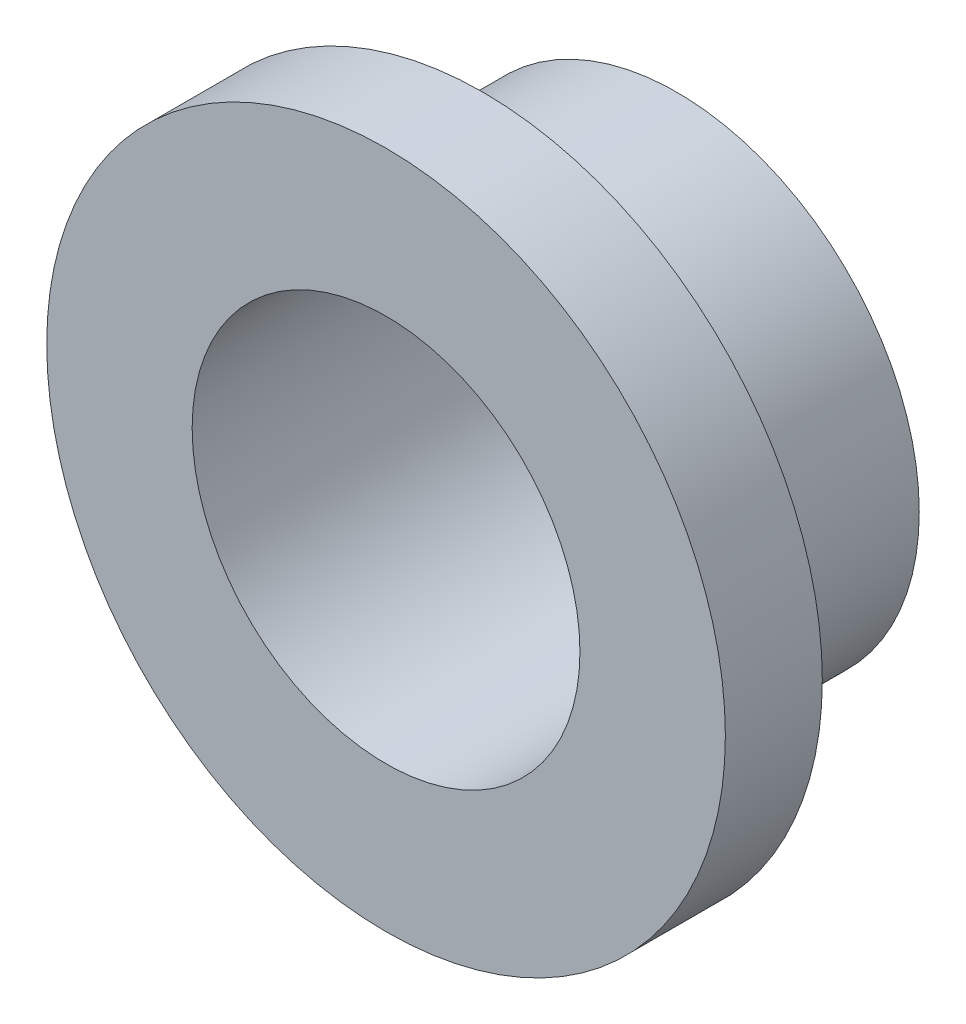
ISO-10303-21;
HEADER;
FILE_DESCRIPTION(('STEP AP214'),'2;1');
FILE_NAME('part.step','',(''),(''),'','','');
FILE_SCHEMA(('AUTOMOTIVE_DESIGN { 1 0 10303 214 1 1 1 1 }'));
ENDSEC;
DATA;
#1=APPLICATION_CONTEXT('core data for automotive mechanical design processes');
#2=APPLICATION_PROTOCOL_DEFINITION('international standard','automotive_design',2000,#1);
#3=PRODUCT_CONTEXT('',#1,'mechanical');
#4=PRODUCT('Part','Part','',(#3));
#5=PRODUCT_RELATED_PRODUCT_CATEGORY('part','',(#4));
#6=PRODUCT_DEFINITION_FORMATION('','',#4);
#7=PRODUCT_DEFINITION_CONTEXT('part definition',#1,'design');
#8=PRODUCT_DEFINITION('design','',#6,#7);
#9=PRODUCT_DEFINITION_SHAPE('','',#8);
#10=(LENGTH_UNIT() NAMED_UNIT(*) SI_UNIT(.MILLI.,.METRE.));
#11=(NAMED_UNIT(*) PLANE_ANGLE_UNIT() SI_UNIT($,.RADIAN.));
#12=(NAMED_UNIT(*) SI_UNIT($,.STERADIAN.) SOLID_ANGLE_UNIT());
#13=UNCERTAINTY_MEASURE_WITH_UNIT(LENGTH_MEASURE(1.E-05),#10,'distance_accuracy_value','');
#14=(GEOMETRIC_REPRESENTATION_CONTEXT(3) GLOBAL_UNCERTAINTY_ASSIGNED_CONTEXT((#13)) GLOBAL_UNIT_ASSIGNED_CONTEXT((#10,
#11,#12)) REPRESENTATION_CONTEXT('',''));
#15=CARTESIAN_POINT('',(0.,0.,0.));
#16=DIRECTION('',(0.,0.,1.));
#17=DIRECTION('',(1.,0.,0.));
#18=AXIS2_PLACEMENT_3D('',#15,#16,#17);
#19=CARTESIAN_POINT('',(0.,0.,9.525));
#20=DIRECTION('',(0.,0.,-1.));
#21=DIRECTION('',(-1.,0.,0.));
#22=AXIS2_PLACEMENT_3D('',#19,#20,#21);
#23=CYLINDRICAL_SURFACE('',#22,7.9375);
#24=CARTESIAN_POINT('',(0.,0.,0.));
#25=DIRECTION('',(0.,0.,1.));
#26=DIRECTION('',(1.,0.,0.));
#27=AXIS2_PLACEMENT_3D('',#24,#25,#26);
#28=CIRCLE('',#27,7.9375);
#29=CARTESIAN_POINT('',(-7.9375,0.,0.));
#30=VERTEX_POINT('',#29);
#31=EDGE_CURVE('E33',#30,#30,#28,.T.);
#32=CARTESIAN_POINT('',(0.,0.,6.35));
#33=DIRECTION('',(0.,0.,1.));
#34=DIRECTION('',(1.,0.,0.));
#35=AXIS2_PLACEMENT_3D('',#32,#33,#34);
#36=CIRCLE('',#35,7.9375);
#37=CARTESIAN_POINT('',(-7.9375,0.,6.35));
#38=VERTEX_POINT('',#37);
#39=EDGE_CURVE('E10',#38,#38,#36,.T.);
#40=CARTESIAN_POINT('',(-7.9375,0.,0.));
#41=CARTESIAN_POINT('',(-7.9375,0.,0.0661458333333336));
#42=CARTESIAN_POINT('',(-7.9375,0.,0.132291666666667));
#43=CARTESIAN_POINT('',(-7.9375,0.,0.264583333333334));
#44=CARTESIAN_POINT('',(-7.9375,0.,0.330729166666667));
#45=CARTESIAN_POINT('',(-7.9375,0.,0.463020833333333));
#46=CARTESIAN_POINT('',(-7.9375,0.,0.529166666666667));
#47=CARTESIAN_POINT('',(-7.9375,0.,0.661458333333333));
#48=CARTESIAN_POINT('',(-7.9375,0.,0.727604166666666));
#49=CARTESIAN_POINT('',(-7.9375,0.,0.859895833333333));
#50=CARTESIAN_POINT('',(-7.9375,0.,0.926041666666666));
#51=CARTESIAN_POINT('',(-7.9375,0.,1.05833333333333));
#52=CARTESIAN_POINT('',(-7.9375,0.,1.12447916666667));
#53=CARTESIAN_POINT('',(-7.9375,0.,1.25677083333333));
#54=CARTESIAN_POINT('',(-7.9375,0.,1.32291666666667));
#55=CARTESIAN_POINT('',(-7.9375,0.,1.45520833333333));
#56=CARTESIAN_POINT('',(-7.9375,0.,1.52135416666667));
#57=CARTESIAN_POINT('',(-7.9375,0.,1.65364583333333));
#58=CARTESIAN_POINT('',(-7.9375,0.,1.71979166666667));
#59=CARTESIAN_POINT('',(-7.9375,0.,1.85208333333333));
#60=CARTESIAN_POINT('',(-7.9375,0.,1.91822916666667));
#61=CARTESIAN_POINT('',(-7.9375,0.,2.05052083333333));
#62=CARTESIAN_POINT('',(-7.9375,0.,2.11666666666667));
#63=CARTESIAN_POINT('',(-7.9375,0.,2.24895833333333));
#64=CARTESIAN_POINT('',(-7.9375,0.,2.31510416666667));
#65=CARTESIAN_POINT('',(-7.9375,0.,2.44739583333333));
#66=CARTESIAN_POINT('',(-7.9375,0.,2.51354166666667));
#67=CARTESIAN_POINT('',(-7.9375,0.,2.64583333333333));
#68=CARTESIAN_POINT('',(-7.9375,0.,2.71197916666667));
#69=CARTESIAN_POINT('',(-7.9375,0.,2.84427083333333));
#70=CARTESIAN_POINT('',(-7.9375,0.,2.91041666666667));
#71=CARTESIAN_POINT('',(-7.9375,0.,3.04270833333333));
#72=CARTESIAN_POINT('',(-7.9375,0.,3.10885416666667));
#73=CARTESIAN_POINT('',(-7.9375,0.,3.24114583333333));
#74=CARTESIAN_POINT('',(-7.9375,0.,3.30729166666667));
#75=CARTESIAN_POINT('',(-7.9375,0.,3.43958333333333));
#76=CARTESIAN_POINT('',(-7.9375,0.,3.50572916666667));
#77=CARTESIAN_POINT('',(-7.9375,0.,3.63802083333333));
#78=CARTESIAN_POINT('',(-7.9375,0.,3.70416666666667));
#79=CARTESIAN_POINT('',(-7.9375,0.,3.83645833333333));
#80=CARTESIAN_POINT('',(-7.9375,0.,3.90260416666667));
#81=CARTESIAN_POINT('',(-7.9375,0.,4.03489583333333));
#82=CARTESIAN_POINT('',(-7.9375,0.,4.10104166666667));
#83=CARTESIAN_POINT('',(-7.9375,0.,4.23333333333333));
#84=CARTESIAN_POINT('',(-7.9375,0.,4.29947916666667));
#85=CARTESIAN_POINT('',(-7.9375,0.,4.43177083333333));
#86=CARTESIAN_POINT('',(-7.9375,0.,4.49791666666667));
#87=CARTESIAN_POINT('',(-7.9375,0.,4.63020833333333));
#88=CARTESIAN_POINT('',(-7.9375,0.,4.69635416666667));
#89=CARTESIAN_POINT('',(-7.9375,0.,4.82864583333333));
#90=CARTESIAN_POINT('',(-7.9375,0.,4.89479166666667));
#91=CARTESIAN_POINT('',(-7.9375,0.,5.02708333333333));
#92=CARTESIAN_POINT('',(-7.9375,0.,5.09322916666667));
#93=CARTESIAN_POINT('',(-7.9375,0.,5.22552083333333));
#94=CARTESIAN_POINT('',(-7.9375,0.,5.29166666666667));
#95=CARTESIAN_POINT('',(-7.9375,0.,5.42395833333333));
#96=CARTESIAN_POINT('',(-7.9375,0.,5.49010416666667));
#97=CARTESIAN_POINT('',(-7.9375,0.,5.62239583333333));
#98=CARTESIAN_POINT('',(-7.9375,0.,5.68854166666667));
#99=CARTESIAN_POINT('',(-7.9375,0.,5.82083333333333));
#100=CARTESIAN_POINT('',(-7.9375,0.,5.88697916666667));
#101=CARTESIAN_POINT('',(-7.9375,0.,6.01927083333333));
#102=CARTESIAN_POINT('',(-7.9375,0.,6.08541666666667));
#103=CARTESIAN_POINT('',(-7.9375,0.,6.21770833333333));
#104=CARTESIAN_POINT('',(-7.9375,0.,6.28385416666667));
#105=CARTESIAN_POINT('',(-7.9375,0.,6.35));
#106=B_SPLINE_CURVE_WITH_KNOTS('',3,(#40,#41,#42,#43,#44,#45,#46,#47,#48,#49,#50,#51,#52,#53,
#54,#55,#56,#57,#58,#59,#60,#61,#62,#63,#64,#65,#66,#67,#68,#69,#70,#71,#72,#73,#74,#75,#76,#77,
#78,#79,#80,#81,#82,#83,#84,#85,#86,#87,#88,#89,#90,#91,#92,#93,#94,#95,#96,#97,#98,#99,#100,
#101,#102,#103,#104,#105),.UNSPECIFIED.,.F.,.F.,(4,2,2,2,2,2,2,2,2,2,2,2,2,2,2,2,2,2,2,2,2,2,2,
2,2,2,2,2,2,2,2,2,4),(0.,0.198437500000001,0.396875,0.5953125,0.793749999999999,0.9921875,
1.190625,1.3890625,1.5875,1.7859375,1.984375,2.1828125,2.38125,2.5796875,2.778125,2.9765625,
3.175,3.3734375,3.571875,3.7703125,3.96875,4.1671875,4.365625,4.5640625,4.7625,4.9609375,
5.159375,5.3578125,5.55625,5.7546875,5.953125,6.1515625,6.35),.UNSPECIFIED.);
#107=EDGE_CURVE('BSEAM30',#30,#38,#106,.T.);
#108=ORIENTED_EDGE('',*,*,#31,.T.);
#109=ORIENTED_EDGE('',*,*,#39,.F.);
#110=ORIENTED_EDGE('',*,*,#107,.T.);
#111=ORIENTED_EDGE('',*,*,#107,.F.);
#112=EDGE_LOOP('',(#108,#110,#109,#111));
#113=FACE_BOUND('',#112,.T.);
#114=ADVANCED_FACE('F30',(#113),#23,.T.);
#115=CARTESIAN_POINT('',(0.,0.,9.525));
#116=DIRECTION('',(0.,0.,1.));
#117=DIRECTION('',(1.,0.,0.));
#118=AXIS2_PLACEMENT_3D('',#115,#116,#117);
#119=PLANE('',#118);
#120=CARTESIAN_POINT('',(0.,0.,9.525));
#121=DIRECTION('',(0.,0.,1.));
#122=DIRECTION('',(1.,0.,0.));
#123=AXIS2_PLACEMENT_3D('',#120,#121,#122);
#124=CIRCLE('',#123,6.35);
#125=CARTESIAN_POINT('',(-6.35,0.,9.525));
#126=VERTEX_POINT('',#125);
#127=EDGE_CURVE('E41',#126,#126,#124,.T.);
#128=ORIENTED_EDGE('',*,*,#127,.F.);
#129=EDGE_LOOP('',(#128));
#130=FACE_BOUND('',#129,.T.);
#131=CARTESIAN_POINT('',(0.,0.,9.525));
#132=DIRECTION('',(0.,0.,1.));
#133=DIRECTION('',(1.,0.,0.));
#134=AXIS2_PLACEMENT_3D('',#131,#132,#133);
#135=CIRCLE('',#134,11.1125);
#136=CARTESIAN_POINT('',(11.1125,0.,9.525));
#137=VERTEX_POINT('',#136);
#138=EDGE_CURVE('E44',#137,#137,#135,.T.);
#139=ORIENTED_EDGE('',*,*,#138,.T.);
#140=EDGE_LOOP('',(#139));
#141=FACE_BOUND('',#140,.T.);
#142=ADVANCED_FACE('F58',(#130,#141),#119,.T.);
#143=CARTESIAN_POINT('',(0.,0.,0.));
#144=DIRECTION('',(0.,0.,1.));
#145=DIRECTION('',(1.,0.,0.));
#146=AXIS2_PLACEMENT_3D('',#143,#144,#145);
#147=PLANE('',#146);
#148=ORIENTED_EDGE('',*,*,#31,.F.);
#149=EDGE_LOOP('',(#148));
#150=FACE_BOUND('',#149,.T.);
#151=CARTESIAN_POINT('',(0.,0.,0.));
#152=DIRECTION('',(0.,0.,1.));
#153=DIRECTION('',(1.,0.,0.));
#154=AXIS2_PLACEMENT_3D('',#151,#152,#153);
#155=CIRCLE('',#154,6.35);
#156=CARTESIAN_POINT('',(-6.35,0.,0.));
#157=VERTEX_POINT('',#156);
#158=EDGE_CURVE('E47',#157,#157,#155,.T.);
#159=ORIENTED_EDGE('',*,*,#158,.T.);
#160=EDGE_LOOP('',(#159));
#161=FACE_BOUND('',#160,.T.);
#162=ADVANCED_FACE('F76',(#150,#161),#147,.F.);
#163=CARTESIAN_POINT('',(0.,0.,9.525));
#164=DIRECTION('',(0.,0.,-1.));
#165=DIRECTION('',(-1.,0.,0.));
#166=AXIS2_PLACEMENT_3D('',#163,#164,#165);
#167=CYLINDRICAL_SURFACE('',#166,6.35);
#168=CARTESIAN_POINT('',(-6.35,0.,9.525));
#169=CARTESIAN_POINT('',(-6.35,0.,9.42578125));
#170=CARTESIAN_POINT('',(-6.35,0.,9.3265625));
#171=CARTESIAN_POINT('',(-6.35,0.,9.128125));
#172=CARTESIAN_POINT('',(-6.35,0.,9.02890625));
#173=CARTESIAN_POINT('',(-6.35,0.,8.83046875));
#174=CARTESIAN_POINT('',(-6.35,0.,8.73125));
#175=CARTESIAN_POINT('',(-6.35,0.,8.5328125));
#176=CARTESIAN_POINT('',(-6.35,0.,8.43359375));
#177=CARTESIAN_POINT('',(-6.35,0.,8.23515625));
#178=CARTESIAN_POINT('',(-6.35,0.,8.1359375));
#179=CARTESIAN_POINT('',(-6.35,0.,7.9375));
#180=CARTESIAN_POINT('',(-6.35,0.,7.83828125));
#181=CARTESIAN_POINT('',(-6.35,0.,7.63984375));
#182=CARTESIAN_POINT('',(-6.35,0.,7.540625));
#183=CARTESIAN_POINT('',(-6.35,0.,7.3421875));
#184=CARTESIAN_POINT('',(-6.35,0.,7.24296875));
#185=CARTESIAN_POINT('',(-6.35,0.,7.04453125));
#186=CARTESIAN_POINT('',(-6.35,0.,6.9453125));
#187=CARTESIAN_POINT('',(-6.35,0.,6.746875));
#188=CARTESIAN_POINT('',(-6.35,0.,6.64765625));
#189=CARTESIAN_POINT('',(-6.35,0.,6.44921875));
#190=CARTESIAN_POINT('',(-6.35,0.,6.35));
#191=CARTESIAN_POINT('',(-6.35,0.,6.1515625));
#192=CARTESIAN_POINT('',(-6.35,0.,6.05234375));
#193=CARTESIAN_POINT('',(-6.35,0.,5.85390625));
#194=CARTESIAN_POINT('',(-6.35,0.,5.7546875));
#195=CARTESIAN_POINT('',(-6.35,0.,5.55625));
#196=CARTESIAN_POINT('',(-6.35,0.,5.45703125));
#197=CARTESIAN_POINT('',(-6.35,0.,5.25859375));
#198=CARTESIAN_POINT('',(-6.35,0.,5.159375));
#199=CARTESIAN_POINT('',(-6.35,0.,4.9609375));
#200=CARTESIAN_POINT('',(-6.35,0.,4.86171875));
#201=CARTESIAN_POINT('',(-6.35,0.,4.66328125));
#202=CARTESIAN_POINT('',(-6.35,0.,4.5640625));
#203=CARTESIAN_POINT('',(-6.35,0.,4.365625));
#204=CARTESIAN_POINT('',(-6.35,0.,4.26640625));
#205=CARTESIAN_POINT('',(-6.35,0.,4.06796875));
#206=CARTESIAN_POINT('',(-6.35,0.,3.96875));
#207=CARTESIAN_POINT('',(-6.35,0.,3.7703125));
#208=CARTESIAN_POINT('',(-6.35,0.,3.67109375));
#209=CARTESIAN_POINT('',(-6.35,0.,3.47265625));
#210=CARTESIAN_POINT('',(-6.35,0.,3.3734375));
#211=CARTESIAN_POINT('',(-6.35,0.,3.175));
#212=CARTESIAN_POINT('',(-6.35,0.,3.07578125));
#213=CARTESIAN_POINT('',(-6.35,0.,2.87734375));
#214=CARTESIAN_POINT('',(-6.35,0.,2.778125));
#215=CARTESIAN_POINT('',(-6.35,0.,2.5796875));
#216=CARTESIAN_POINT('',(-6.35,0.,2.48046875));
#217=CARTESIAN_POINT('',(-6.35,0.,2.28203125));
#218=CARTESIAN_POINT('',(-6.35,0.,2.1828125));
#219=CARTESIAN_POINT('',(-6.35,0.,1.984375));
#220=CARTESIAN_POINT('',(-6.35,0.,1.88515625));
#221=CARTESIAN_POINT('',(-6.35,0.,1.68671875));
#222=CARTESIAN_POINT('',(-6.35,0.,1.5875));
#223=CARTESIAN_POINT('',(-6.35,0.,1.3890625));
#224=CARTESIAN_POINT('',(-6.35,0.,1.28984375));
#225=CARTESIAN_POINT('',(-6.35,0.,1.09140625));
#226=CARTESIAN_POINT('',(-6.35,0.,0.992187500000001));
#227=CARTESIAN_POINT('',(-6.35,0.,0.793750000000001));
#228=CARTESIAN_POINT('',(-6.35,0.,0.69453125));
#229=CARTESIAN_POINT('',(-6.35,0.,0.49609375));
#230=CARTESIAN_POINT('',(-6.35,0.,0.396875));
#231=CARTESIAN_POINT('',(-6.35,0.,0.1984375));
#232=CARTESIAN_POINT('',(-6.35,0.,0.0992187500000001));
#233=CARTESIAN_POINT('',(-6.35,0.,0.));
#234=B_SPLINE_CURVE_WITH_KNOTS('',3,(#168,#169,#170,#171,#172,#173,#174,#175,#176,#177,#178,
#179,#180,#181,#182,#183,#184,#185,#186,#187,#188,#189,#190,#191,#192,#193,#194,#195,#196,#197,
#198,#199,#200,#201,#202,#203,#204,#205,#206,#207,#208,#209,#210,#211,#212,#213,#214,#215,#216,
#217,#218,#219,#220,#221,#222,#223,#224,#225,#226,#227,#228,#229,#230,#231,#232,#233),
.UNSPECIFIED.,.F.,.F.,(4,2,2,2,2,2,2,2,2,2,2,2,2,2,2,2,2,2,2,2,2,2,2,2,2,2,2,2,2,2,2,2,4),(0.,
0.297656249999998,0.595312499999999,0.892968749999999,1.190625,1.48828125,1.7859375,2.08359375,
2.38125,2.67890625,2.9765625,3.27421875,3.571875,3.86953125,4.1671875,4.46484375,4.7625,
5.06015625,5.3578125,5.65546875,5.953125,6.25078125,6.5484375,6.84609375,7.14375,7.44140625,
7.7390625,8.03671875,8.334375,8.63203125,8.9296875,9.22734375,9.525),.UNSPECIFIED.);
#235=EDGE_CURVE('BSEAM67',#126,#157,#234,.T.);
#236=ORIENTED_EDGE('',*,*,#127,.T.);
#237=ORIENTED_EDGE('',*,*,#158,.F.);
#238=ORIENTED_EDGE('',*,*,#235,.T.);
#239=ORIENTED_EDGE('',*,*,#235,.F.);
#240=EDGE_LOOP('',(#236,#238,#237,#239));
#241=FACE_BOUND('',#240,.T.);
#242=ADVANCED_FACE('F67',(#241),#167,.F.);
#243=CARTESIAN_POINT('',(0.,0.,6.35));
#244=DIRECTION('',(0.,0.,1.));
#245=DIRECTION('',(1.,0.,0.));
#246=AXIS2_PLACEMENT_3D('',#243,#244,#245);
#247=PLANE('',#246);
#248=CARTESIAN_POINT('',(0.,0.,6.35));
#249=DIRECTION('',(0.,0.,1.));
#250=DIRECTION('',(1.,0.,0.));
#251=AXIS2_PLACEMENT_3D('',#248,#249,#250);
#252=CIRCLE('',#251,11.1125);
#253=CARTESIAN_POINT('',(11.1125,0.,6.35));
#254=VERTEX_POINT('',#253);
#255=EDGE_CURVE('E49',#254,#254,#252,.T.);
#256=ORIENTED_EDGE('',*,*,#255,.F.);
#257=EDGE_LOOP('',(#256));
#258=FACE_BOUND('',#257,.T.);
#259=ORIENTED_EDGE('',*,*,#39,.T.);
#260=EDGE_LOOP('',(#259));
#261=FACE_BOUND('',#260,.T.);
#262=ADVANCED_FACE('F62',(#258,#261),#247,.F.);
#263=CARTESIAN_POINT('',(0.,0.,6.35));
#264=DIRECTION('',(0.,0.,1.));
#265=DIRECTION('',(1.,0.,0.));
#266=AXIS2_PLACEMENT_3D('',#263,#264,#265);
#267=CYLINDRICAL_SURFACE('',#266,11.1125);
#268=ORIENTED_EDGE('',*,*,#255,.T.);
#269=EDGE_LOOP('',(#268));
#270=FACE_BOUND('',#269,.T.);
#271=ORIENTED_EDGE('',*,*,#138,.F.);
#272=EDGE_LOOP('',(#271));
#273=FACE_BOUND('',#272,.T.);
#274=ADVANCED_FACE('F60',(#270,#273),#267,.T.);
#275=CLOSED_SHELL('',(#114,#142,#162,#242,#262,#274));
#276=MANIFOLD_SOLID_BREP('B2',#275);
#277=ADVANCED_BREP_SHAPE_REPRESENTATION('',(#18,#276),#14);
#278=SHAPE_DEFINITION_REPRESENTATION(#9,#277);
ENDSEC;
END-ISO-10303-21;
